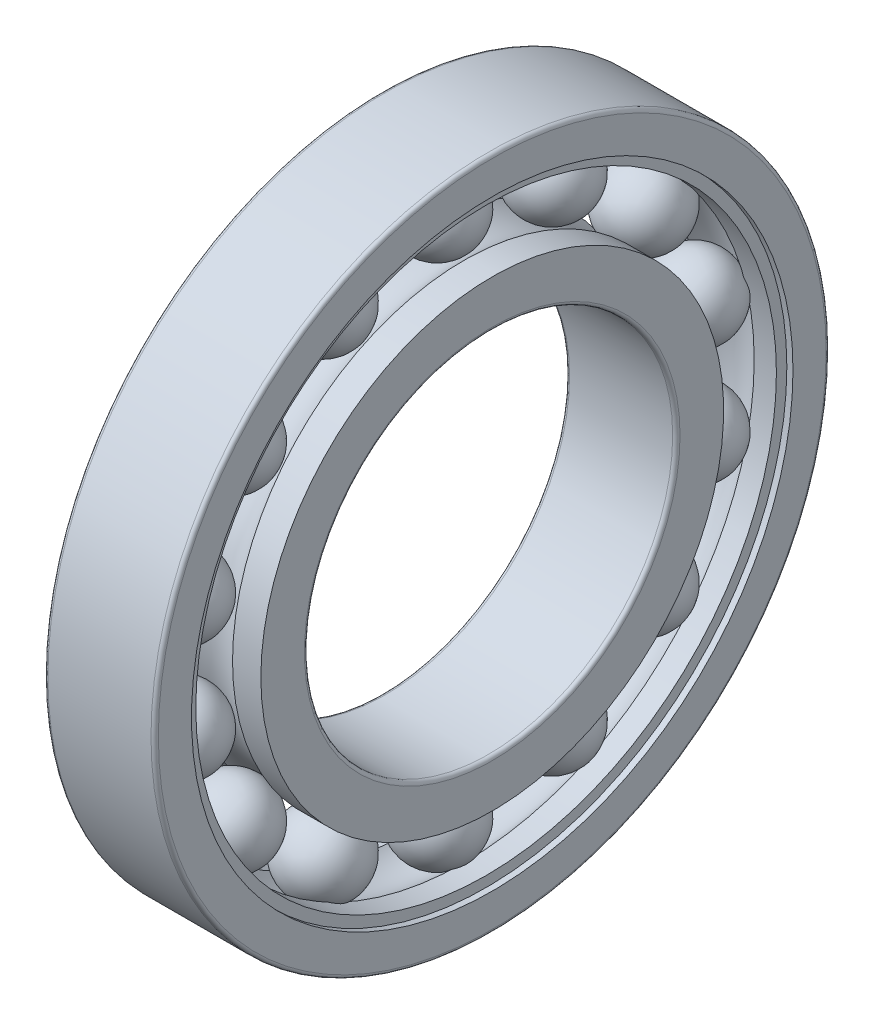
ISO-10303-21;
HEADER;
FILE_DESCRIPTION(('STEP AP214'),'2;1');
FILE_NAME('part.step','',(''),(''),'','','');
FILE_SCHEMA(('AUTOMOTIVE_DESIGN { 1 0 10303 214 1 1 1 1 }'));
ENDSEC;
DATA;
#1=APPLICATION_CONTEXT('core data for automotive mechanical design processes');
#2=APPLICATION_PROTOCOL_DEFINITION('international standard','automotive_design',2000,#1);
#3=PRODUCT_CONTEXT('',#1,'mechanical');
#4=PRODUCT('Part','Part','',(#3));
#5=PRODUCT_RELATED_PRODUCT_CATEGORY('part','',(#4));
#6=PRODUCT_DEFINITION_FORMATION('','',#4);
#7=PRODUCT_DEFINITION_CONTEXT('part definition',#1,'design');
#8=PRODUCT_DEFINITION('design','',#6,#7);
#9=PRODUCT_DEFINITION_SHAPE('','',#8);
#10=(LENGTH_UNIT() NAMED_UNIT(*) SI_UNIT(.MILLI.,.METRE.));
#11=(NAMED_UNIT(*) PLANE_ANGLE_UNIT() SI_UNIT($,.RADIAN.));
#12=(NAMED_UNIT(*) SI_UNIT($,.STERADIAN.) SOLID_ANGLE_UNIT());
#13=UNCERTAINTY_MEASURE_WITH_UNIT(LENGTH_MEASURE(1.E-05),#10,'distance_accuracy_value','');
#14=(GEOMETRIC_REPRESENTATION_CONTEXT(3) GLOBAL_UNCERTAINTY_ASSIGNED_CONTEXT((#13)) GLOBAL_UNIT_ASSIGNED_CONTEXT((#10,
#11,#12)) REPRESENTATION_CONTEXT('',''));
#15=CARTESIAN_POINT('',(0.,0.,0.));
#16=DIRECTION('',(0.,0.,1.));
#17=DIRECTION('',(1.,0.,0.));
#18=AXIS2_PLACEMENT_3D('',#15,#16,#17);
#19=CARTESIAN_POINT('',(0.,19.3708306599021,9.32850039102725));
#20=DIRECTION('',(-1.,0.,0.));
#21=DIRECTION('',(0.,0.900968867902425,0.433883739117546));
#22=AXIS2_PLACEMENT_3D('',#19,#20,#21);
#23=SPHERICAL_SURFACE('',#22,3.225);
#24=CARTESIAN_POINT('',(-3.225,19.3708306599021,9.32850039102725));
#25=VERTEX_POINT('',#24);
#26=VERTEX_LOOP('',#25);
#27=FACE_BOUND('',#26,.T.);
#28=ADVANCED_FACE('F37',(#27),#23,.T.);
#29=CLOSED_SHELL('',(#28));
#30=MANIFOLD_SOLID_BREP('B2',#29);
#31=CARTESIAN_POINT('',(0.,13.405030739963,16.8093768730625));
#32=DIRECTION('',(-1.,0.,0.));
#33=DIRECTION('',(0.,0.623489801858743,0.781831482468022));
#34=AXIS2_PLACEMENT_3D('',#31,#32,#33);
#35=SPHERICAL_SURFACE('',#34,3.225);
#36=CARTESIAN_POINT('',(-3.225,13.405030739963,16.8093768730625));
#37=VERTEX_POINT('',#36);
#38=VERTEX_LOOP('',#37);
#39=FACE_BOUND('',#38,.T.);
#40=ADVANCED_FACE('F55',(#39),#35,.T.);
#41=CLOSED_SHELL('',(#40));
#42=MANIFOLD_SOLID_BREP('B6',#41);
#43=CARTESIAN_POINT('',(0.,4.78420008006098,20.9609501119092));
#44=DIRECTION('',(-1.,0.,0.));
#45=DIRECTION('',(0.,0.222520933956325,0.974927912181821));
#46=AXIS2_PLACEMENT_3D('',#43,#44,#45);
#47=SPHERICAL_SURFACE('',#46,3.225);
#48=CARTESIAN_POINT('',(-3.225,4.78420008006098,20.9609501119092));
#49=VERTEX_POINT('',#48);
#50=VERTEX_LOOP('',#49);
#51=FACE_BOUND('',#50,.T.);
#52=ADVANCED_FACE('F73',(#51),#47,.T.);
#53=CLOSED_SHELL('',(#52));
#54=MANIFOLD_SOLID_BREP('B33',#53);
#55=CARTESIAN_POINT('',(0.,-4.78420008006056,20.9609501119093));
#56=DIRECTION('',(-1.,0.,0.));
#57=DIRECTION('',(0.,-0.222520933956305,0.974927912181826));
#58=AXIS2_PLACEMENT_3D('',#55,#56,#57);
#59=SPHERICAL_SURFACE('',#58,3.225);
#60=CARTESIAN_POINT('',(-3.225,-4.78420008006056,20.9609501119093));
#61=VERTEX_POINT('',#60);
#62=VERTEX_LOOP('',#61);
#63=FACE_BOUND('',#62,.T.);
#64=ADVANCED_FACE('F91',(#63),#59,.T.);
#65=CLOSED_SHELL('',(#64));
#66=MANIFOLD_SOLID_BREP('B51',#65);
#67=CARTESIAN_POINT('',(0.,-13.4050307399626,16.8093768730628));
#68=DIRECTION('',(-1.,0.,0.));
#69=DIRECTION('',(0.,-0.623489801858727,0.781831482468035));
#70=AXIS2_PLACEMENT_3D('',#67,#68,#69);
#71=SPHERICAL_SURFACE('',#70,3.225);
#72=CARTESIAN_POINT('',(-3.225,-13.4050307399626,16.8093768730628));
#73=VERTEX_POINT('',#72);
#74=VERTEX_LOOP('',#73);
#75=FACE_BOUND('',#74,.T.);
#76=ADVANCED_FACE('F109',(#75),#71,.T.);
#77=CLOSED_SHELL('',(#76));
#78=MANIFOLD_SOLID_BREP('B69',#77);
#79=CARTESIAN_POINT('',(0.,-19.3708306599019,9.32850039102765));
#80=DIRECTION('',(-1.,0.,0.));
#81=DIRECTION('',(0.,-0.900968867902416,0.433883739117565));
#82=AXIS2_PLACEMENT_3D('',#79,#80,#81);
#83=SPHERICAL_SURFACE('',#82,3.225);
#84=CARTESIAN_POINT('',(-3.225,-19.3708306599019,9.32850039102765));
#85=VERTEX_POINT('',#84);
#86=VERTEX_LOOP('',#85);
#87=FACE_BOUND('',#86,.T.);
#88=ADVANCED_FACE('F127',(#87),#83,.T.);
#89=CLOSED_SHELL('',(#88));
#90=MANIFOLD_SOLID_BREP('B87',#89);
#91=CARTESIAN_POINT('',(0.,-21.5,0.));
#92=DIRECTION('',(-1.,0.,0.));
#93=DIRECTION('',(0.,-1.,0.));
#94=AXIS2_PLACEMENT_3D('',#91,#92,#93);
#95=SPHERICAL_SURFACE('',#94,3.225);
#96=CARTESIAN_POINT('',(-3.225,-21.5,0.));
#97=VERTEX_POINT('',#96);
#98=VERTEX_LOOP('',#97);
#99=FACE_BOUND('',#98,.T.);
#100=ADVANCED_FACE('F145',(#99),#95,.T.);
#101=CLOSED_SHELL('',(#100));
#102=MANIFOLD_SOLID_BREP('B105',#101);
#103=CARTESIAN_POINT('',(0.,-19.3708306599021,-9.32850039102738));
#104=DIRECTION('',(-1.,0.,0.));
#105=DIRECTION('',(0.,-0.900968867902422,-0.433883739117553));
#106=AXIS2_PLACEMENT_3D('',#103,#104,#105);
#107=SPHERICAL_SURFACE('',#106,3.225);
#108=CARTESIAN_POINT('',(-3.225,-19.3708306599021,-9.32850039102738));
#109=VERTEX_POINT('',#108);
#110=VERTEX_LOOP('',#109);
#111=FACE_BOUND('',#110,.T.);
#112=ADVANCED_FACE('F163',(#111),#107,.T.);
#113=CLOSED_SHELL('',(#112));
#114=MANIFOLD_SOLID_BREP('B123',#113);
#115=CARTESIAN_POINT('',(0.,-13.4050307399629,-16.8093768730626));
#116=DIRECTION('',(-1.,0.,0.));
#117=DIRECTION('',(0.,-0.623489801858737,-0.781831482468027));
#118=AXIS2_PLACEMENT_3D('',#115,#116,#117);
#119=SPHERICAL_SURFACE('',#118,3.225);
#120=CARTESIAN_POINT('',(-3.225,-13.4050307399629,-16.8093768730626));
#121=VERTEX_POINT('',#120);
#122=VERTEX_LOOP('',#121);
#123=FACE_BOUND('',#122,.T.);
#124=ADVANCED_FACE('F181',(#123),#119,.T.);
#125=CLOSED_SHELL('',(#124));
#126=MANIFOLD_SOLID_BREP('B141',#125);
#127=CARTESIAN_POINT('',(0.,-4.78420008006084,-20.9609501119092));
#128=DIRECTION('',(-1.,0.,0.));
#129=DIRECTION('',(0.,-0.222520933956318,-0.974927912181823));
#130=AXIS2_PLACEMENT_3D('',#127,#128,#129);
#131=SPHERICAL_SURFACE('',#130,3.225);
#132=CARTESIAN_POINT('',(-3.225,-4.78420008006084,-20.9609501119092));
#133=VERTEX_POINT('',#132);
#134=VERTEX_LOOP('',#133);
#135=FACE_BOUND('',#134,.T.);
#136=ADVANCED_FACE('F199',(#135),#131,.T.);
#137=CLOSED_SHELL('',(#136));
#138=MANIFOLD_SOLID_BREP('B159',#137);
#139=CARTESIAN_POINT('',(0.,4.7842000800607,-20.9609501119092));
#140=DIRECTION('',(-1.,0.,0.));
#141=DIRECTION('',(0.,0.222520933956311,-0.974927912181824));
#142=AXIS2_PLACEMENT_3D('',#139,#140,#141);
#143=SPHERICAL_SURFACE('',#142,3.225);
#144=CARTESIAN_POINT('',(-3.225,4.7842000800607,-20.9609501119092));
#145=VERTEX_POINT('',#144);
#146=VERTEX_LOOP('',#145);
#147=FACE_BOUND('',#146,.T.);
#148=ADVANCED_FACE('F217',(#147),#143,.T.);
#149=CLOSED_SHELL('',(#148));
#150=MANIFOLD_SOLID_BREP('B177',#149);
#151=CARTESIAN_POINT('',(0.,13.4050307399627,-16.8093768730627));
#152=DIRECTION('',(-1.,0.,0.));
#153=DIRECTION('',(0.,0.623489801858732,-0.781831482468031));
#154=AXIS2_PLACEMENT_3D('',#151,#152,#153);
#155=SPHERICAL_SURFACE('',#154,3.225);
#156=CARTESIAN_POINT('',(-3.225,13.4050307399627,-16.8093768730627));
#157=VERTEX_POINT('',#156);
#158=VERTEX_LOOP('',#157);
#159=FACE_BOUND('',#158,.T.);
#160=ADVANCED_FACE('F235',(#159),#155,.T.);
#161=CLOSED_SHELL('',(#160));
#162=MANIFOLD_SOLID_BREP('B195',#161);
#163=CARTESIAN_POINT('',(0.,19.370830659902,-9.32850039102752));
#164=DIRECTION('',(-1.,0.,0.));
#165=DIRECTION('',(0.,0.900968867902419,-0.433883739117559));
#166=AXIS2_PLACEMENT_3D('',#163,#164,#165);
#167=SPHERICAL_SURFACE('',#166,3.225);
#168=CARTESIAN_POINT('',(-3.225,19.370830659902,-9.32850039102752));
#169=VERTEX_POINT('',#168);
#170=VERTEX_LOOP('',#169);
#171=FACE_BOUND('',#170,.T.);
#172=ADVANCED_FACE('F253',(#171),#167,.T.);
#173=CLOSED_SHELL('',(#172));
#174=MANIFOLD_SOLID_BREP('B213',#173);
#175=CARTESIAN_POINT('',(0.,21.5,0.));
#176=DIRECTION('',(-1.,0.,0.));
#177=DIRECTION('',(0.,1.,0.));
#178=AXIS2_PLACEMENT_3D('',#175,#176,#177);
#179=SPHERICAL_SURFACE('',#178,3.225);
#180=CARTESIAN_POINT('',(-3.225,21.5,0.));
#181=VERTEX_POINT('',#180);
#182=VERTEX_LOOP('',#181);
#183=FACE_BOUND('',#182,.T.);
#184=ADVANCED_FACE('F273',(#183),#179,.T.);
#185=CLOSED_SHELL('',(#184));
#186=MANIFOLD_SOLID_BREP('B231',#185);
#187=CARTESIAN_POINT('',(-4.50000000000001,0.,0.));
#188=DIRECTION('',(1.,0.,0.));
#189=DIRECTION('',(0.,0.,-1.));
#190=AXIS2_PLACEMENT_3D('',#187,#188,#189);
#191=PLANE('',#190);
#192=CARTESIAN_POINT('',(-4.50000000000001,0.,0.));
#193=DIRECTION('',(1.,0.,0.));
#194=DIRECTION('',(0.,0.,-1.));
#195=AXIS2_PLACEMENT_3D('',#192,#193,#194);
#196=CIRCLE('',#195,27.2);
#197=CARTESIAN_POINT('',(-4.50000000000001,0.,-27.2));
#198=VERTEX_POINT('',#197);
#199=EDGE_CURVE('E307',#198,#198,#196,.F.);
#200=ORIENTED_EDGE('',*,*,#199,.T.);
#201=EDGE_LOOP('',(#200));
#202=FACE_BOUND('',#201,.T.);
#203=CARTESIAN_POINT('',(-4.49999999999999,0.,0.));
#204=DIRECTION('',(1.,0.,0.));
#205=DIRECTION('',(0.,0.,-1.));
#206=AXIS2_PLACEMENT_3D('',#203,#204,#205);
#207=CIRCLE('',#206,24.5);
#208=CARTESIAN_POINT('',(-4.49999999999999,0.,-24.5));
#209=VERTEX_POINT('',#208);
#210=EDGE_CURVE('E328',#209,#209,#207,.T.);
#211=ORIENTED_EDGE('',*,*,#210,.T.);
#212=EDGE_LOOP('',(#211));
#213=FACE_BOUND('',#212,.T.);
#214=ADVANCED_FACE('F292',(#202,#213),#191,.F.);
#215=CARTESIAN_POINT('',(0.,0.,0.));
#216=DIRECTION('',(-1.,0.,0.));
#217=DIRECTION('',(0.,0.,1.));
#218=AXIS2_PLACEMENT_3D('',#215,#216,#217);
#219=CYLINDRICAL_SURFACE('',#218,23.65);
#220=CARTESIAN_POINT('',(-2.19146070008111,0.,0.));
#221=DIRECTION('',(-1.,0.,0.));
#222=DIRECTION('',(0.,0.,1.));
#223=AXIS2_PLACEMENT_3D('',#220,#221,#222);
#224=CIRCLE('',#223,23.65);
#225=CARTESIAN_POINT('',(-2.19146070008111,0.,23.65));
#226=VERTEX_POINT('',#225);
#227=EDGE_CURVE('E315',#226,#226,#224,.T.);
#228=ORIENTED_EDGE('',*,*,#227,.F.);
#229=EDGE_LOOP('',(#228));
#230=FACE_BOUND('',#229,.T.);
#231=CARTESIAN_POINT('',(-3.99999999999999,0.,0.));
#232=DIRECTION('',(1.,0.,0.));
#233=DIRECTION('',(0.,0.,-1.));
#234=AXIS2_PLACEMENT_3D('',#231,#232,#233);
#235=CIRCLE('',#234,23.65);
#236=CARTESIAN_POINT('',(-3.99999999999999,0.,-23.65));
#237=VERTEX_POINT('',#236);
#238=EDGE_CURVE('E331',#237,#237,#235,.T.);
#239=ORIENTED_EDGE('',*,*,#238,.F.);
#240=EDGE_LOOP('',(#239));
#241=FACE_BOUND('',#240,.T.);
#242=ADVANCED_FACE('F339',(#230,#241),#219,.F.);
#243=CARTESIAN_POINT('',(2.19146070008111,0.,0.));
#244=DIRECTION('',(-1.,0.,0.));
#245=DIRECTION('',(0.,0.,1.));
#246=AXIS2_PLACEMENT_3D('',#243,#244,#245);
#247=CIRCLE('',#246,23.65);
#248=CARTESIAN_POINT('',(2.19146070008111,0.,23.65));
#249=VERTEX_POINT('',#248);
#250=EDGE_CURVE('E312',#249,#249,#247,.T.);
#251=ORIENTED_EDGE('',*,*,#250,.T.);
#252=EDGE_LOOP('',(#251));
#253=FACE_BOUND('',#252,.T.);
#254=CARTESIAN_POINT('',(3.99999999999999,0.,0.));
#255=DIRECTION('',(1.,0.,0.));
#256=DIRECTION('',(0.,0.,-1.));
#257=AXIS2_PLACEMENT_3D('',#254,#255,#256);
#258=CIRCLE('',#257,23.65);
#259=CARTESIAN_POINT('',(3.99999999999999,0.,-23.65));
#260=VERTEX_POINT('',#259);
#261=EDGE_CURVE('E322',#260,#260,#258,.T.);
#262=ORIENTED_EDGE('',*,*,#261,.T.);
#263=EDGE_LOOP('',(#262));
#264=FACE_BOUND('',#263,.T.);
#265=ADVANCED_FACE('F341',(#253,#264),#219,.F.);
#266=CARTESIAN_POINT('',(0.,0.,0.));
#267=DIRECTION('',(-1.,0.,0.));
#268=DIRECTION('',(0.,0.,1.));
#269=AXIS2_PLACEMENT_3D('',#266,#267,#268);
#270=TOROIDAL_SURFACE('',#269,21.25,3.25);
#271=ORIENTED_EDGE('',*,*,#227,.T.);
#272=EDGE_LOOP('',(#271));
#273=FACE_BOUND('',#272,.T.);
#274=ORIENTED_EDGE('',*,*,#250,.F.);
#275=EDGE_LOOP('',(#274));
#276=FACE_BOUND('',#275,.T.);
#277=ADVANCED_FACE('F348',(#273,#276),#270,.F.);
#278=CARTESIAN_POINT('',(4.49999999999999,0.,0.));
#279=DIRECTION('',(1.,0.,0.));
#280=DIRECTION('',(0.,0.,-1.));
#281=AXIS2_PLACEMENT_3D('',#278,#279,#280);
#282=PLANE('',#281);
#283=CARTESIAN_POINT('',(4.49999999999999,0.,0.));
#284=DIRECTION('',(1.,0.,0.));
#285=DIRECTION('',(0.,0.,-1.));
#286=AXIS2_PLACEMENT_3D('',#283,#284,#285);
#287=CIRCLE('',#286,27.2);
#288=CARTESIAN_POINT('',(4.49999999999999,0.,-27.2));
#289=VERTEX_POINT('',#288);
#290=EDGE_CURVE('E272',#289,#289,#287,.T.);
#291=ORIENTED_EDGE('',*,*,#290,.T.);
#292=EDGE_LOOP('',(#291));
#293=FACE_BOUND('',#292,.T.);
#294=CARTESIAN_POINT('',(4.49999999999999,0.,0.));
#295=DIRECTION('',(1.,0.,0.));
#296=DIRECTION('',(0.,0.,-1.));
#297=AXIS2_PLACEMENT_3D('',#294,#295,#296);
#298=CIRCLE('',#297,24.5);
#299=CARTESIAN_POINT('',(4.49999999999999,0.,-24.5));
#300=VERTEX_POINT('',#299);
#301=EDGE_CURVE('E319',#300,#300,#298,.T.);
#302=ORIENTED_EDGE('',*,*,#301,.F.);
#303=EDGE_LOOP('',(#302));
#304=FACE_BOUND('',#303,.T.);
#305=ADVANCED_FACE('F360',(#293,#304),#282,.T.);
#306=CARTESIAN_POINT('',(0.,0.,0.));
#307=DIRECTION('',(-1.,0.,0.));
#308=DIRECTION('',(0.,0.,1.));
#309=AXIS2_PLACEMENT_3D('',#306,#307,#308);
#310=CYLINDRICAL_SURFACE('',#309,27.5);
#311=CARTESIAN_POINT('',(-4.20000000000001,0.,0.));
#312=DIRECTION('',(1.,0.,0.));
#313=DIRECTION('',(0.,0.,-1.));
#314=AXIS2_PLACEMENT_3D('',#311,#312,#313);
#315=CIRCLE('',#314,27.5);
#316=CARTESIAN_POINT('',(-4.20000000000001,0.,-27.5));
#317=VERTEX_POINT('',#316);
#318=EDGE_CURVE('E299',#317,#317,#315,.T.);
#319=ORIENTED_EDGE('',*,*,#318,.T.);
#320=EDGE_LOOP('',(#319));
#321=FACE_BOUND('',#320,.T.);
#322=CARTESIAN_POINT('',(4.19999999999999,0.,0.));
#323=DIRECTION('',(1.,0.,0.));
#324=DIRECTION('',(0.,0.,-1.));
#325=AXIS2_PLACEMENT_3D('',#322,#323,#324);
#326=CIRCLE('',#325,27.5);
#327=CARTESIAN_POINT('',(4.19999999999999,0.,-27.5));
#328=VERTEX_POINT('',#327);
#329=EDGE_CURVE('E303',#328,#328,#326,.F.);
#330=ORIENTED_EDGE('',*,*,#329,.T.);
#331=EDGE_LOOP('',(#330));
#332=FACE_BOUND('',#331,.T.);
#333=ADVANCED_FACE('F357',(#321,#332),#310,.T.);
#334=CARTESIAN_POINT('',(3.99999999999999,0.,0.));
#335=DIRECTION('',(1.,0.,0.));
#336=DIRECTION('',(0.,0.,-1.));
#337=AXIS2_PLACEMENT_3D('',#334,#335,#336);
#338=CYLINDRICAL_SURFACE('',#337,24.5);
#339=CARTESIAN_POINT('',(3.99999999999999,0.,0.));
#340=DIRECTION('',(1.,0.,0.));
#341=DIRECTION('',(0.,0.,-1.));
#342=AXIS2_PLACEMENT_3D('',#339,#340,#341);
#343=CIRCLE('',#342,24.5);
#344=CARTESIAN_POINT('',(3.99999999999999,0.,-24.5));
#345=VERTEX_POINT('',#344);
#346=EDGE_CURVE('E318',#345,#345,#343,.T.);
#347=ORIENTED_EDGE('',*,*,#346,.F.);
#348=EDGE_LOOP('',(#347));
#349=FACE_BOUND('',#348,.T.);
#350=ORIENTED_EDGE('',*,*,#301,.T.);
#351=EDGE_LOOP('',(#350));
#352=FACE_BOUND('',#351,.T.);
#353=ADVANCED_FACE('F354',(#349,#352),#338,.F.);
#354=CARTESIAN_POINT('',(3.99999999999999,0.,0.));
#355=DIRECTION('',(1.,0.,0.));
#356=DIRECTION('',(0.,0.,-1.));
#357=AXIS2_PLACEMENT_3D('',#354,#355,#356);
#358=PLANE('',#357);
#359=ORIENTED_EDGE('',*,*,#261,.F.);
#360=EDGE_LOOP('',(#359));
#361=FACE_BOUND('',#360,.T.);
#362=ORIENTED_EDGE('',*,*,#346,.T.);
#363=EDGE_LOOP('',(#362));
#364=FACE_BOUND('',#363,.T.);
#365=ADVANCED_FACE('F384',(#361,#364),#358,.T.);
#366=CARTESIAN_POINT('',(-3.99999999999999,0.,0.));
#367=DIRECTION('',(-1.,0.,0.));
#368=DIRECTION('',(0.,0.,-1.));
#369=AXIS2_PLACEMENT_3D('',#366,#367,#368);
#370=PLANE('',#369);
#371=CARTESIAN_POINT('',(-3.99999999999999,0.,0.));
#372=DIRECTION('',(1.,0.,0.));
#373=DIRECTION('',(0.,0.,-1.));
#374=AXIS2_PLACEMENT_3D('',#371,#372,#373);
#375=CIRCLE('',#374,24.5);
#376=CARTESIAN_POINT('',(-3.99999999999999,0.,-24.5));
#377=VERTEX_POINT('',#376);
#378=EDGE_CURVE('E327',#377,#377,#375,.T.);
#379=ORIENTED_EDGE('',*,*,#378,.F.);
#380=EDGE_LOOP('',(#379));
#381=FACE_BOUND('',#380,.T.);
#382=ORIENTED_EDGE('',*,*,#238,.T.);
#383=EDGE_LOOP('',(#382));
#384=FACE_BOUND('',#383,.T.);
#385=ADVANCED_FACE('F337',(#381,#384),#370,.T.);
#386=CARTESIAN_POINT('',(-3.99999999999999,0.,0.));
#387=DIRECTION('',(-1.,0.,0.));
#388=DIRECTION('',(0.,0.,1.));
#389=AXIS2_PLACEMENT_3D('',#386,#387,#388);
#390=CYLINDRICAL_SURFACE('',#389,24.5);
#391=ORIENTED_EDGE('',*,*,#378,.T.);
#392=EDGE_LOOP('',(#391));
#393=FACE_BOUND('',#392,.T.);
#394=ORIENTED_EDGE('',*,*,#210,.F.);
#395=EDGE_LOOP('',(#394));
#396=FACE_BOUND('',#395,.T.);
#397=ADVANCED_FACE('F367',(#393,#396),#390,.F.);
#398=CARTESIAN_POINT('',(-4.20000000000001,0.,0.));
#399=DIRECTION('',(1.,0.,0.));
#400=DIRECTION('',(0.,0.,-1.));
#401=AXIS2_PLACEMENT_3D('',#398,#399,#400);
#402=TOROIDAL_SURFACE('',#401,27.2,0.3);
#403=ORIENTED_EDGE('',*,*,#318,.F.);
#404=EDGE_LOOP('',(#403));
#405=FACE_BOUND('',#404,.T.);
#406=ORIENTED_EDGE('',*,*,#199,.F.);
#407=EDGE_LOOP('',(#406));
#408=FACE_BOUND('',#407,.T.);
#409=ADVANCED_FACE('F365',(#405,#408),#402,.T.);
#410=CARTESIAN_POINT('',(4.19999999999999,0.,0.));
#411=DIRECTION('',(1.,0.,0.));
#412=DIRECTION('',(0.,0.,-1.));
#413=AXIS2_PLACEMENT_3D('',#410,#411,#412);
#414=TOROIDAL_SURFACE('',#413,27.2,0.3);
#415=ORIENTED_EDGE('',*,*,#290,.F.);
#416=EDGE_LOOP('',(#415));
#417=FACE_BOUND('',#416,.T.);
#418=ORIENTED_EDGE('',*,*,#329,.F.);
#419=EDGE_LOOP('',(#418));
#420=FACE_BOUND('',#419,.T.);
#421=ADVANCED_FACE('F294',(#417,#420),#414,.T.);
#422=CLOSED_SHELL('',(#214,#242,#265,#277,#305,#333,#353,#365,#385,#397,#409,#421));
#423=MANIFOLD_SOLID_BREP('B249',#422);
#424=CARTESIAN_POINT('',(0.,0.,0.));
#425=DIRECTION('',(-1.,0.,0.));
#426=DIRECTION('',(0.,0.,1.));
#427=AXIS2_PLACEMENT_3D('',#424,#425,#426);
#428=TOROIDAL_SURFACE('',#427,21.25,3.25);
#429=CARTESIAN_POINT('',(2.19146070008112,0.,0.));
#430=DIRECTION('',(-1.,0.,0.));
#431=DIRECTION('',(0.,0.,1.));
#432=AXIS2_PLACEMENT_3D('',#429,#430,#431);
#433=CIRCLE('',#432,18.85);
#434=CARTESIAN_POINT('',(2.19146070008112,0.,18.85));
#435=VERTEX_POINT('',#434);
#436=EDGE_CURVE('E501',#435,#435,#433,.T.);
#437=ORIENTED_EDGE('',*,*,#436,.T.);
#438=EDGE_LOOP('',(#437));
#439=FACE_BOUND('',#438,.T.);
#440=CARTESIAN_POINT('',(-2.19146070008112,0.,0.));
#441=DIRECTION('',(-1.,0.,0.));
#442=DIRECTION('',(0.,0.,1.));
#443=AXIS2_PLACEMENT_3D('',#440,#441,#442);
#444=CIRCLE('',#443,18.85);
#445=CARTESIAN_POINT('',(-2.19146070008112,0.,18.85));
#446=VERTEX_POINT('',#445);
#447=EDGE_CURVE('E492',#446,#446,#444,.T.);
#448=ORIENTED_EDGE('',*,*,#447,.F.);
#449=EDGE_LOOP('',(#448));
#450=FACE_BOUND('',#449,.T.);
#451=ADVANCED_FACE('F472',(#439,#450),#428,.F.);
#452=CARTESIAN_POINT('',(0.,0.,0.));
#453=DIRECTION('',(-1.,0.,0.));
#454=DIRECTION('',(0.,0.,1.));
#455=AXIS2_PLACEMENT_3D('',#452,#453,#454);
#456=CYLINDRICAL_SURFACE('',#455,18.85);
#457=CARTESIAN_POINT('',(-4.5,0.,0.));
#458=DIRECTION('',(-1.,0.,0.));
#459=DIRECTION('',(0.,0.,1.));
#460=AXIS2_PLACEMENT_3D('',#457,#458,#459);
#461=CIRCLE('',#460,18.85);
#462=CARTESIAN_POINT('',(-4.5,0.,18.85));
#463=VERTEX_POINT('',#462);
#464=EDGE_CURVE('E495',#463,#463,#461,.T.);
#465=ORIENTED_EDGE('',*,*,#464,.F.);
#466=EDGE_LOOP('',(#465));
#467=FACE_BOUND('',#466,.T.);
#468=ORIENTED_EDGE('',*,*,#447,.T.);
#469=EDGE_LOOP('',(#468));
#470=FACE_BOUND('',#469,.T.);
#471=ADVANCED_FACE('F513',(#467,#470),#456,.T.);
#472=CARTESIAN_POINT('',(-4.5,0.,0.));
#473=DIRECTION('',(1.,0.,0.));
#474=DIRECTION('',(0.,0.,-1.));
#475=AXIS2_PLACEMENT_3D('',#472,#473,#474);
#476=PLANE('',#475);
#477=CARTESIAN_POINT('',(-4.5,0.,0.));
#478=DIRECTION('',(1.,0.,0.));
#479=DIRECTION('',(0.,0.,-1.));
#480=AXIS2_PLACEMENT_3D('',#477,#478,#479);
#481=CIRCLE('',#480,15.3);
#482=CARTESIAN_POINT('',(-4.5,0.,-15.3));
#483=VERTEX_POINT('',#482);
#484=EDGE_CURVE('E479',#483,#483,#481,.T.);
#485=ORIENTED_EDGE('',*,*,#484,.T.);
#486=EDGE_LOOP('',(#485));
#487=FACE_BOUND('',#486,.T.);
#488=ORIENTED_EDGE('',*,*,#464,.T.);
#489=EDGE_LOOP('',(#488));
#490=FACE_BOUND('',#489,.T.);
#491=ADVANCED_FACE('F522',(#487,#490),#476,.F.);
#492=CARTESIAN_POINT('',(0.,0.,0.));
#493=DIRECTION('',(-1.,0.,0.));
#494=DIRECTION('',(0.,0.,1.));
#495=AXIS2_PLACEMENT_3D('',#492,#493,#494);
#496=CYLINDRICAL_SURFACE('',#495,15.);
#497=CARTESIAN_POINT('',(-4.2,0.,0.));
#498=DIRECTION('',(1.,0.,0.));
#499=DIRECTION('',(0.,0.,-1.));
#500=AXIS2_PLACEMENT_3D('',#497,#498,#499);
#501=CIRCLE('',#500,15.);
#502=CARTESIAN_POINT('',(-4.2,0.,-15.));
#503=VERTEX_POINT('',#502);
#504=EDGE_CURVE('E483',#503,#503,#501,.F.);
#505=ORIENTED_EDGE('',*,*,#504,.T.);
#506=EDGE_LOOP('',(#505));
#507=FACE_BOUND('',#506,.T.);
#508=CARTESIAN_POINT('',(4.2,0.,0.));
#509=DIRECTION('',(1.,0.,0.));
#510=DIRECTION('',(0.,0.,-1.));
#511=AXIS2_PLACEMENT_3D('',#508,#509,#510);
#512=CIRCLE('',#511,15.);
#513=CARTESIAN_POINT('',(4.2,0.,-15.));
#514=VERTEX_POINT('',#513);
#515=EDGE_CURVE('E487',#514,#514,#512,.T.);
#516=ORIENTED_EDGE('',*,*,#515,.T.);
#517=EDGE_LOOP('',(#516));
#518=FACE_BOUND('',#517,.T.);
#519=ADVANCED_FACE('F517',(#507,#518),#496,.F.);
#520=CARTESIAN_POINT('',(4.5,0.,0.));
#521=DIRECTION('',(1.,0.,0.));
#522=DIRECTION('',(0.,0.,-1.));
#523=AXIS2_PLACEMENT_3D('',#520,#521,#522);
#524=PLANE('',#523);
#525=CARTESIAN_POINT('',(4.5,0.,0.));
#526=DIRECTION('',(1.,0.,0.));
#527=DIRECTION('',(0.,0.,-1.));
#528=AXIS2_PLACEMENT_3D('',#525,#526,#527);
#529=CIRCLE('',#528,15.3);
#530=CARTESIAN_POINT('',(4.5,0.,-15.3));
#531=VERTEX_POINT('',#530);
#532=EDGE_CURVE('E291',#531,#531,#529,.F.);
#533=ORIENTED_EDGE('',*,*,#532,.T.);
#534=EDGE_LOOP('',(#533));
#535=FACE_BOUND('',#534,.T.);
#536=CARTESIAN_POINT('',(4.5,0.,0.));
#537=DIRECTION('',(-1.,0.,0.));
#538=DIRECTION('',(0.,0.,1.));
#539=AXIS2_PLACEMENT_3D('',#536,#537,#538);
#540=CIRCLE('',#539,18.85);
#541=CARTESIAN_POINT('',(4.5,0.,18.85));
#542=VERTEX_POINT('',#541);
#543=EDGE_CURVE('E498',#542,#542,#540,.T.);
#544=ORIENTED_EDGE('',*,*,#543,.F.);
#545=EDGE_LOOP('',(#544));
#546=FACE_BOUND('',#545,.T.);
#547=ADVANCED_FACE('F511',(#535,#546),#524,.T.);
#548=ORIENTED_EDGE('',*,*,#436,.F.);
#549=EDGE_LOOP('',(#548));
#550=FACE_BOUND('',#549,.T.);
#551=ORIENTED_EDGE('',*,*,#543,.T.);
#552=EDGE_LOOP('',(#551));
#553=FACE_BOUND('',#552,.T.);
#554=ADVANCED_FACE('F507',(#550,#553),#456,.T.);
#555=CARTESIAN_POINT('',(-4.2,0.,0.));
#556=DIRECTION('',(1.,0.,0.));
#557=DIRECTION('',(0.,0.,-1.));
#558=AXIS2_PLACEMENT_3D('',#555,#556,#557);
#559=TOROIDAL_SURFACE('',#558,15.3,0.3);
#560=ORIENTED_EDGE('',*,*,#484,.F.);
#561=EDGE_LOOP('',(#560));
#562=FACE_BOUND('',#561,.T.);
#563=ORIENTED_EDGE('',*,*,#504,.F.);
#564=EDGE_LOOP('',(#563));
#565=FACE_BOUND('',#564,.T.);
#566=ADVANCED_FACE('F510',(#562,#565),#559,.T.);
#567=CARTESIAN_POINT('',(4.2,0.,0.));
#568=DIRECTION('',(1.,0.,0.));
#569=DIRECTION('',(0.,0.,-1.));
#570=AXIS2_PLACEMENT_3D('',#567,#568,#569);
#571=TOROIDAL_SURFACE('',#570,15.3,0.3);
#572=ORIENTED_EDGE('',*,*,#515,.F.);
#573=EDGE_LOOP('',(#572));
#574=FACE_BOUND('',#573,.T.);
#575=ORIENTED_EDGE('',*,*,#532,.F.);
#576=EDGE_LOOP('',(#575));
#577=FACE_BOUND('',#576,.T.);
#578=ADVANCED_FACE('F474',(#574,#577),#571,.T.);
#579=CLOSED_SHELL('',(#451,#471,#491,#519,#547,#554,#566,#578));
#580=MANIFOLD_SOLID_BREP('B267',#579);
#581=ADVANCED_BREP_SHAPE_REPRESENTATION('',(#18,#30,#42,#54,#66,#78,#90,#102,#114,#126,#138,
#150,#162,#174,#186,#423,#580),#14);
#582=SHAPE_DEFINITION_REPRESENTATION(#9,#581);
ENDSEC;
END-ISO-10303-21;
